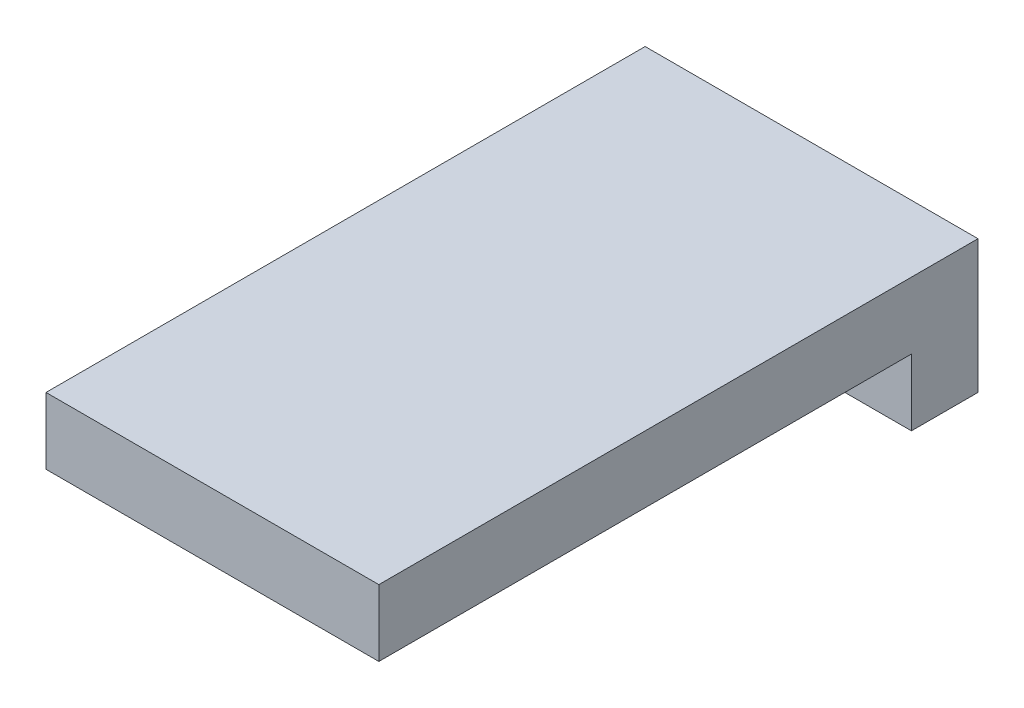
ISO-10303-21;
HEADER;
FILE_DESCRIPTION(('STEP AP214'),'2;1');
FILE_NAME('part.step','',(''),(''),'','','');
FILE_SCHEMA(('AUTOMOTIVE_DESIGN { 1 0 10303 214 1 1 1 1 }'));
ENDSEC;
DATA;
#1=APPLICATION_CONTEXT('core data for automotive mechanical design processes');
#2=APPLICATION_PROTOCOL_DEFINITION('international standard','automotive_design',2000,#1);
#3=PRODUCT_CONTEXT('',#1,'mechanical');
#4=PRODUCT('Part','Part','',(#3));
#5=PRODUCT_RELATED_PRODUCT_CATEGORY('part','',(#4));
#6=PRODUCT_DEFINITION_FORMATION('','',#4);
#7=PRODUCT_DEFINITION_CONTEXT('part definition',#1,'design');
#8=PRODUCT_DEFINITION('design','',#6,#7);
#9=PRODUCT_DEFINITION_SHAPE('','',#8);
#10=(LENGTH_UNIT() NAMED_UNIT(*) SI_UNIT(.MILLI.,.METRE.));
#11=(NAMED_UNIT(*) PLANE_ANGLE_UNIT() SI_UNIT($,.RADIAN.));
#12=(NAMED_UNIT(*) SI_UNIT($,.STERADIAN.) SOLID_ANGLE_UNIT());
#13=UNCERTAINTY_MEASURE_WITH_UNIT(LENGTH_MEASURE(1.E-05),#10,'distance_accuracy_value','');
#14=(GEOMETRIC_REPRESENTATION_CONTEXT(3) GLOBAL_UNCERTAINTY_ASSIGNED_CONTEXT((#13)) GLOBAL_UNIT_ASSIGNED_CONTEXT((#10,
#11,#12)) REPRESENTATION_CONTEXT('',''));
#15=CARTESIAN_POINT('',(0.,0.,0.));
#16=DIRECTION('',(0.,0.,1.));
#17=DIRECTION('',(1.,0.,0.));
#18=AXIS2_PLACEMENT_3D('',#15,#16,#17);
#19=CARTESIAN_POINT('',(12.5,5.,42.5));
#20=DIRECTION('',(0.,1.,0.));
#21=DIRECTION('',(-1.,0.,0.));
#22=AXIS2_PLACEMENT_3D('',#19,#20,#21);
#23=PLANE('',#22);
#24=DIRECTION('',(1.,0.,0.));
#25=VECTOR('',#24,1.);
#26=CARTESIAN_POINT('',(12.5,5.,2.5));
#27=LINE('',#26,#25);
#28=CARTESIAN_POINT('',(-12.5,5.,2.5));
#29=VERTEX_POINT('',#28);
#30=CARTESIAN_POINT('',(12.5,5.,2.5));
#31=VERTEX_POINT('',#30);
#32=EDGE_CURVE('E131',#29,#31,#27,.T.);
#33=ORIENTED_EDGE('',*,*,#32,.T.);
#34=DIRECTION('',(0.,0.,-1.));
#35=VECTOR('',#34,1.);
#36=CARTESIAN_POINT('',(12.5,5.,42.5));
#37=LINE('',#36,#35);
#38=CARTESIAN_POINT('',(12.5,5.,42.5));
#39=VERTEX_POINT('',#38);
#40=EDGE_CURVE('E149',#39,#31,#37,.T.);
#41=ORIENTED_EDGE('',*,*,#40,.F.);
#42=DIRECTION('',(1.,0.,0.));
#43=VECTOR('',#42,1.);
#44=CARTESIAN_POINT('',(12.5,5.,42.5));
#45=LINE('',#44,#43);
#46=CARTESIAN_POINT('',(-12.5,5.,42.5));
#47=VERTEX_POINT('',#46);
#48=EDGE_CURVE('E142',#47,#39,#45,.T.);
#49=ORIENTED_EDGE('',*,*,#48,.F.);
#50=DIRECTION('',(0.,0.,-1.));
#51=VECTOR('',#50,1.);
#52=CARTESIAN_POINT('',(-12.5,5.,42.5));
#53=LINE('',#52,#51);
#54=EDGE_CURVE('E153',#47,#29,#53,.T.);
#55=ORIENTED_EDGE('',*,*,#54,.T.);
#56=EDGE_LOOP('',(#33,#41,#49,#55));
#57=FACE_BOUND('',#56,.T.);
#58=DIRECTION('',(0.,0.,-1.));
#59=VECTOR('',#58,1.);
#60=CARTESIAN_POINT('',(-3.67068015994088,5.,36.1977440650174));
#61=LINE('',#60,#59);
#62=CARTESIAN_POINT('',(-3.67068015994088,5.,38.6977440650174));
#63=VERTEX_POINT('',#62);
#64=CARTESIAN_POINT('',(-3.67068015994088,5.,36.1977440650174));
#65=VERTEX_POINT('',#64);
#66=EDGE_CURVE('E130',#63,#65,#61,.T.);
#67=ORIENTED_EDGE('',*,*,#66,.F.);
#68=DIRECTION('',(-1.,0.,0.));
#69=VECTOR('',#68,1.);
#70=CARTESIAN_POINT('',(3.32931984005912,5.,38.6977440650174));
#71=LINE('',#70,#69);
#72=CARTESIAN_POINT('',(3.32931984005912,5.,38.6977440650174));
#73=VERTEX_POINT('',#72);
#74=EDGE_CURVE('E127',#73,#63,#71,.T.);
#75=ORIENTED_EDGE('',*,*,#74,.F.);
#76=DIRECTION('',(0.,0.,1.));
#77=VECTOR('',#76,1.);
#78=CARTESIAN_POINT('',(3.32931984005912,5.,36.1977440650174));
#79=LINE('',#78,#77);
#80=CARTESIAN_POINT('',(3.32931984005912,5.,36.1977440650174));
#81=VERTEX_POINT('',#80);
#82=EDGE_CURVE('E53',#81,#73,#79,.T.);
#83=ORIENTED_EDGE('',*,*,#82,.F.);
#84=DIRECTION('',(1.,0.,0.));
#85=VECTOR('',#84,1.);
#86=CARTESIAN_POINT('',(3.32931984005912,5.,36.1977440650174));
#87=LINE('',#86,#85);
#88=EDGE_CURVE('E48',#65,#81,#87,.T.);
#89=ORIENTED_EDGE('',*,*,#88,.F.);
#90=EDGE_LOOP('',(#67,#75,#83,#89));
#91=FACE_BOUND('',#90,.T.);
#92=ADVANCED_FACE('F33',(#57,#91),#23,.F.);
#93=CARTESIAN_POINT('',(-12.5,10.,2.5));
#94=DIRECTION('',(0.,0.,-1.));
#95=DIRECTION('',(-1.,0.,0.));
#96=AXIS2_PLACEMENT_3D('',#93,#94,#95);
#97=PLANE('',#96);
#98=ORIENTED_EDGE('',*,*,#32,.F.);
#99=DIRECTION('',(0.,-1.,0.));
#100=VECTOR('',#99,1.);
#101=CARTESIAN_POINT('',(-12.5,10.,2.5));
#102=LINE('',#101,#100);
#103=CARTESIAN_POINT('',(-12.5,0.,2.5));
#104=VERTEX_POINT('',#103);
#105=EDGE_CURVE('E176',#29,#104,#102,.T.);
#106=ORIENTED_EDGE('',*,*,#105,.T.);
#107=DIRECTION('',(1.,0.,0.));
#108=VECTOR('',#107,1.);
#109=CARTESIAN_POINT('',(-12.5,0.,2.5));
#110=LINE('',#109,#108);
#111=CARTESIAN_POINT('',(12.5,0.,2.5));
#112=VERTEX_POINT('',#111);
#113=EDGE_CURVE('E161',#104,#112,#110,.T.);
#114=ORIENTED_EDGE('',*,*,#113,.T.);
#115=DIRECTION('',(0.,-1.,0.));
#116=VECTOR('',#115,1.);
#117=CARTESIAN_POINT('',(12.5,10.,2.5));
#118=LINE('',#117,#116);
#119=EDGE_CURVE('E165',#31,#112,#118,.T.);
#120=ORIENTED_EDGE('',*,*,#119,.F.);
#121=EDGE_LOOP('',(#98,#106,#114,#120));
#122=FACE_BOUND('',#121,.T.);
#123=ADVANCED_FACE('F191',(#122),#97,.F.);
#124=CARTESIAN_POINT('',(12.5,10.,-2.5));
#125=DIRECTION('',(-1.,0.,0.));
#126=DIRECTION('',(0.,0.,1.));
#127=AXIS2_PLACEMENT_3D('',#124,#125,#126);
#128=PLANE('',#127);
#129=DIRECTION('',(0.,0.,-1.));
#130=VECTOR('',#129,1.);
#131=CARTESIAN_POINT('',(12.5,0.,-2.5));
#132=LINE('',#131,#130);
#133=CARTESIAN_POINT('',(12.5,0.,-2.5));
#134=VERTEX_POINT('',#133);
#135=EDGE_CURVE('E156',#112,#134,#132,.T.);
#136=ORIENTED_EDGE('',*,*,#135,.T.);
#137=DIRECTION('',(0.,-1.,0.));
#138=VECTOR('',#137,1.);
#139=CARTESIAN_POINT('',(12.5,10.,-2.5));
#140=LINE('',#139,#138);
#141=CARTESIAN_POINT('',(12.5,10.,-2.5));
#142=VERTEX_POINT('',#141);
#143=EDGE_CURVE('E11',#142,#134,#140,.T.);
#144=ORIENTED_EDGE('',*,*,#143,.F.);
#145=DIRECTION('',(0.,0.,-1.));
#146=VECTOR('',#145,1.);
#147=CARTESIAN_POINT('',(12.5,10.,-2.5));
#148=LINE('',#147,#146);
#149=CARTESIAN_POINT('',(12.5,10.,42.5));
#150=VERTEX_POINT('',#149);
#151=EDGE_CURVE('E157',#150,#142,#148,.T.);
#152=ORIENTED_EDGE('',*,*,#151,.F.);
#153=DIRECTION('',(0.,1.,0.));
#154=VECTOR('',#153,1.);
#155=CARTESIAN_POINT('',(12.5,5.,42.5));
#156=LINE('',#155,#154);
#157=EDGE_CURVE('E144',#39,#150,#156,.T.);
#158=ORIENTED_EDGE('',*,*,#157,.F.);
#159=ORIENTED_EDGE('',*,*,#40,.T.);
#160=ORIENTED_EDGE('',*,*,#119,.T.);
#161=EDGE_LOOP('',(#136,#144,#152,#158,#159,#160));
#162=FACE_BOUND('',#161,.T.);
#163=ADVANCED_FACE('F35',(#162),#128,.F.);
#164=CARTESIAN_POINT('',(-12.5,10.,-2.5));
#165=DIRECTION('',(0.,0.,1.));
#166=DIRECTION('',(1.,0.,0.));
#167=AXIS2_PLACEMENT_3D('',#164,#165,#166);
#168=PLANE('',#167);
#169=DIRECTION('',(-1.,0.,0.));
#170=VECTOR('',#169,1.);
#171=CARTESIAN_POINT('',(-12.5,0.,-2.5));
#172=LINE('',#171,#170);
#173=CARTESIAN_POINT('',(-12.5,0.,-2.5));
#174=VERTEX_POINT('',#173);
#175=EDGE_CURVE('E168',#134,#174,#172,.T.);
#176=ORIENTED_EDGE('',*,*,#175,.T.);
#177=DIRECTION('',(0.,-1.,0.));
#178=VECTOR('',#177,1.);
#179=CARTESIAN_POINT('',(-12.5,10.,-2.5));
#180=LINE('',#179,#178);
#181=CARTESIAN_POINT('',(-12.5,10.,-2.5));
#182=VERTEX_POINT('',#181);
#183=EDGE_CURVE('E41',#182,#174,#180,.T.);
#184=ORIENTED_EDGE('',*,*,#183,.F.);
#185=DIRECTION('',(-1.,0.,0.));
#186=VECTOR('',#185,1.);
#187=CARTESIAN_POINT('',(-12.5,10.,-2.5));
#188=LINE('',#187,#186);
#189=EDGE_CURVE('E160',#142,#182,#188,.T.);
#190=ORIENTED_EDGE('',*,*,#189,.F.);
#191=ORIENTED_EDGE('',*,*,#143,.T.);
#192=EDGE_LOOP('',(#176,#184,#190,#191));
#193=FACE_BOUND('',#192,.T.);
#194=ADVANCED_FACE('F202',(#193),#168,.F.);
#195=CARTESIAN_POINT('',(-12.5,10.,-2.5));
#196=DIRECTION('',(1.,0.,0.));
#197=DIRECTION('',(0.,0.,-1.));
#198=AXIS2_PLACEMENT_3D('',#195,#196,#197);
#199=PLANE('',#198);
#200=DIRECTION('',(0.,0.,1.));
#201=VECTOR('',#200,1.);
#202=CARTESIAN_POINT('',(-12.5,0.,-2.5));
#203=LINE('',#202,#201);
#204=EDGE_CURVE('E170',#174,#104,#203,.T.);
#205=ORIENTED_EDGE('',*,*,#204,.T.);
#206=ORIENTED_EDGE('',*,*,#105,.F.);
#207=ORIENTED_EDGE('',*,*,#54,.F.);
#208=DIRECTION('',(0.,-1.,0.));
#209=VECTOR('',#208,1.);
#210=CARTESIAN_POINT('',(-12.5,5.,42.5));
#211=LINE('',#210,#209);
#212=CARTESIAN_POINT('',(-12.5,10.,42.5));
#213=VERTEX_POINT('',#212);
#214=EDGE_CURVE('E134',#213,#47,#211,.T.);
#215=ORIENTED_EDGE('',*,*,#214,.F.);
#216=DIRECTION('',(0.,0.,1.));
#217=VECTOR('',#216,1.);
#218=CARTESIAN_POINT('',(-12.5,10.,-2.5));
#219=LINE('',#218,#217);
#220=EDGE_CURVE('E163',#182,#213,#219,.T.);
#221=ORIENTED_EDGE('',*,*,#220,.F.);
#222=ORIENTED_EDGE('',*,*,#183,.T.);
#223=EDGE_LOOP('',(#205,#206,#207,#215,#221,#222));
#224=FACE_BOUND('',#223,.T.);
#225=ADVANCED_FACE('F182',(#224),#199,.F.);
#226=CARTESIAN_POINT('',(0.,10.,0.));
#227=DIRECTION('',(0.,1.,0.));
#228=DIRECTION('',(0.,0.,1.));
#229=AXIS2_PLACEMENT_3D('',#226,#227,#228);
#230=PLANE('',#229);
#231=ORIENTED_EDGE('',*,*,#151,.T.);
#232=ORIENTED_EDGE('',*,*,#189,.T.);
#233=ORIENTED_EDGE('',*,*,#220,.T.);
#234=DIRECTION('',(-1.,0.,0.));
#235=VECTOR('',#234,1.);
#236=CARTESIAN_POINT('',(12.5,10.,42.5));
#237=LINE('',#236,#235);
#238=EDGE_CURVE('E147',#150,#213,#237,.T.);
#239=ORIENTED_EDGE('',*,*,#238,.F.);
#240=EDGE_LOOP('',(#231,#232,#233,#239));
#241=FACE_BOUND('',#240,.T.);
#242=ADVANCED_FACE('F200',(#241),#230,.T.);
#243=CARTESIAN_POINT('',(0.,0.,0.));
#244=DIRECTION('',(0.,1.,0.));
#245=DIRECTION('',(0.,0.,1.));
#246=AXIS2_PLACEMENT_3D('',#243,#244,#245);
#247=PLANE('',#246);
#248=ORIENTED_EDGE('',*,*,#135,.F.);
#249=ORIENTED_EDGE('',*,*,#113,.F.);
#250=ORIENTED_EDGE('',*,*,#204,.F.);
#251=ORIENTED_EDGE('',*,*,#175,.F.);
#252=EDGE_LOOP('',(#248,#249,#250,#251));
#253=FACE_BOUND('',#252,.T.);
#254=ADVANCED_FACE('F189',(#253),#247,.F.);
#255=CARTESIAN_POINT('',(0.,0.,42.5));
#256=DIRECTION('',(0.,0.,1.));
#257=DIRECTION('',(1.,0.,0.));
#258=AXIS2_PLACEMENT_3D('',#255,#256,#257);
#259=PLANE('',#258);
#260=ORIENTED_EDGE('',*,*,#214,.T.);
#261=ORIENTED_EDGE('',*,*,#48,.T.);
#262=ORIENTED_EDGE('',*,*,#157,.T.);
#263=ORIENTED_EDGE('',*,*,#238,.T.);
#264=EDGE_LOOP('',(#260,#261,#262,#263));
#265=FACE_BOUND('',#264,.T.);
#266=ADVANCED_FACE('F197',(#265),#259,.T.);
#267=CARTESIAN_POINT('',(-3.67068015994088,2.5,36.1977440650174));
#268=DIRECTION('',(1.,0.,0.));
#269=DIRECTION('',(0.,1.,0.));
#270=AXIS2_PLACEMENT_3D('',#267,#268,#269);
#271=PLANE('',#270);
#272=ORIENTED_EDGE('',*,*,#66,.T.);
#273=DIRECTION('',(0.,1.,0.));
#274=VECTOR('',#273,1.);
#275=CARTESIAN_POINT('',(-3.67068015994088,2.5,36.1977440650174));
#276=LINE('',#275,#274);
#277=CARTESIAN_POINT('',(-3.67068015994088,2.5,36.1977440650174));
#278=VERTEX_POINT('',#277);
#279=EDGE_CURVE('E111',#278,#65,#276,.T.);
#280=ORIENTED_EDGE('',*,*,#279,.F.);
#281=DIRECTION('',(0.,0.,-1.));
#282=VECTOR('',#281,1.);
#283=CARTESIAN_POINT('',(-3.67068015994088,2.5,36.1977440650174));
#284=LINE('',#283,#282);
#285=CARTESIAN_POINT('',(-3.67068015994088,2.5,38.6977440650174));
#286=VERTEX_POINT('',#285);
#287=EDGE_CURVE('E118',#286,#278,#284,.T.);
#288=ORIENTED_EDGE('',*,*,#287,.F.);
#289=DIRECTION('',(0.,1.,0.));
#290=VECTOR('',#289,1.);
#291=CARTESIAN_POINT('',(-3.67068015994088,2.5,38.6977440650174));
#292=LINE('',#291,#290);
#293=EDGE_CURVE('E321',#286,#63,#292,.T.);
#294=ORIENTED_EDGE('',*,*,#293,.T.);
#295=EDGE_LOOP('',(#272,#280,#288,#294));
#296=FACE_BOUND('',#295,.T.);
#297=ADVANCED_FACE('F129',(#296),#271,.F.);
#298=CARTESIAN_POINT('',(3.32931984005912,2.5,36.1977440650174));
#299=DIRECTION('',(0.,0.,1.));
#300=DIRECTION('',(1.,0.,0.));
#301=AXIS2_PLACEMENT_3D('',#298,#299,#300);
#302=PLANE('',#301);
#303=ORIENTED_EDGE('',*,*,#88,.T.);
#304=DIRECTION('',(0.,1.,0.));
#305=VECTOR('',#304,1.);
#306=CARTESIAN_POINT('',(3.32931984005912,2.5,36.1977440650174));
#307=LINE('',#306,#305);
#308=CARTESIAN_POINT('',(3.32931984005912,2.5,36.1977440650174));
#309=VERTEX_POINT('',#308);
#310=EDGE_CURVE('E114',#309,#81,#307,.T.);
#311=ORIENTED_EDGE('',*,*,#310,.F.);
#312=DIRECTION('',(1.,0.,0.));
#313=VECTOR('',#312,1.);
#314=CARTESIAN_POINT('',(3.32931984005912,2.5,36.1977440650174));
#315=LINE('',#314,#313);
#316=EDGE_CURVE('E107',#278,#309,#315,.T.);
#317=ORIENTED_EDGE('',*,*,#316,.F.);
#318=ORIENTED_EDGE('',*,*,#279,.T.);
#319=EDGE_LOOP('',(#303,#311,#317,#318));
#320=FACE_BOUND('',#319,.T.);
#321=ADVANCED_FACE('F109',(#320),#302,.F.);
#322=CARTESIAN_POINT('',(3.32931984005912,2.5,36.1977440650174));
#323=DIRECTION('',(-1.,0.,0.));
#324=DIRECTION('',(0.,-1.,0.));
#325=AXIS2_PLACEMENT_3D('',#322,#323,#324);
#326=PLANE('',#325);
#327=ORIENTED_EDGE('',*,*,#82,.T.);
#328=DIRECTION('',(0.,1.,0.));
#329=VECTOR('',#328,1.);
#330=CARTESIAN_POINT('',(3.32931984005912,2.5,38.6977440650174));
#331=LINE('',#330,#329);
#332=CARTESIAN_POINT('',(3.32931984005912,2.5,38.6977440650174));
#333=VERTEX_POINT('',#332);
#334=EDGE_CURVE('E136',#333,#73,#331,.T.);
#335=ORIENTED_EDGE('',*,*,#334,.F.);
#336=DIRECTION('',(0.,0.,1.));
#337=VECTOR('',#336,1.);
#338=CARTESIAN_POINT('',(3.32931984005912,2.5,36.1977440650174));
#339=LINE('',#338,#337);
#340=EDGE_CURVE('E117',#309,#333,#339,.T.);
#341=ORIENTED_EDGE('',*,*,#340,.F.);
#342=ORIENTED_EDGE('',*,*,#310,.T.);
#343=EDGE_LOOP('',(#327,#335,#341,#342));
#344=FACE_BOUND('',#343,.T.);
#345=ADVANCED_FACE('F251',(#344),#326,.F.);
#346=CARTESIAN_POINT('',(3.32931984005912,2.5,38.6977440650174));
#347=DIRECTION('',(0.,0.,-1.));
#348=DIRECTION('',(-1.,0.,0.));
#349=AXIS2_PLACEMENT_3D('',#346,#347,#348);
#350=PLANE('',#349);
#351=ORIENTED_EDGE('',*,*,#74,.T.);
#352=ORIENTED_EDGE('',*,*,#293,.F.);
#353=DIRECTION('',(-1.,0.,0.));
#354=VECTOR('',#353,1.);
#355=CARTESIAN_POINT('',(3.32931984005912,2.5,38.6977440650174));
#356=LINE('',#355,#354);
#357=EDGE_CURVE('E123',#333,#286,#356,.T.);
#358=ORIENTED_EDGE('',*,*,#357,.F.);
#359=ORIENTED_EDGE('',*,*,#334,.T.);
#360=EDGE_LOOP('',(#351,#352,#358,#359));
#361=FACE_BOUND('',#360,.T.);
#362=ADVANCED_FACE('F258',(#361),#350,.F.);
#363=CARTESIAN_POINT('',(0.,2.5,0.));
#364=DIRECTION('',(0.,-1.,0.));
#365=DIRECTION('',(1.,0.,0.));
#366=AXIS2_PLACEMENT_3D('',#363,#364,#365);
#367=PLANE('',#366);
#368=ORIENTED_EDGE('',*,*,#287,.T.);
#369=ORIENTED_EDGE('',*,*,#316,.T.);
#370=ORIENTED_EDGE('',*,*,#340,.T.);
#371=ORIENTED_EDGE('',*,*,#357,.T.);
#372=EDGE_LOOP('',(#368,#369,#370,#371));
#373=FACE_BOUND('',#372,.T.);
#374=ADVANCED_FACE('F121',(#373),#367,.T.);
#375=CLOSED_SHELL('',(#92,#123,#163,#194,#225,#242,#254,#266,#297,#321,#345,#362,#374));
#376=MANIFOLD_SOLID_BREP('B2',#375);
#377=ADVANCED_BREP_SHAPE_REPRESENTATION('',(#18,#376),#14);
#378=SHAPE_DEFINITION_REPRESENTATION(#9,#377);
ENDSEC;
END-ISO-10303-21;
